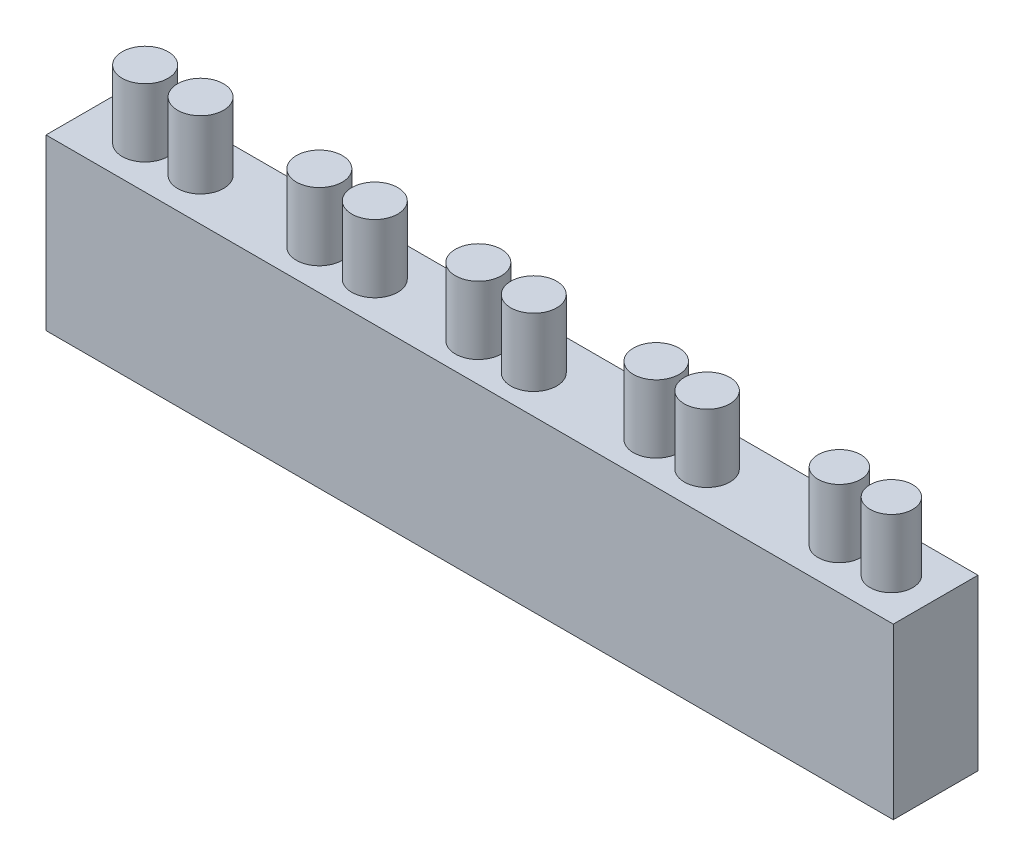
ISO-10303-21;
HEADER;
FILE_DESCRIPTION(('STEP AP214'),'2;1');
FILE_NAME('part.step','',(''),(''),'','','');
FILE_SCHEMA(('AUTOMOTIVE_DESIGN { 1 0 10303 214 1 1 1 1 }'));
ENDSEC;
DATA;
#1=APPLICATION_CONTEXT('core data for automotive mechanical design processes');
#2=APPLICATION_PROTOCOL_DEFINITION('international standard','automotive_design',2000,#1);
#3=PRODUCT_CONTEXT('',#1,'mechanical');
#4=PRODUCT('Part','Part','',(#3));
#5=PRODUCT_RELATED_PRODUCT_CATEGORY('part','',(#4));
#6=PRODUCT_DEFINITION_FORMATION('','',#4);
#7=PRODUCT_DEFINITION_CONTEXT('part definition',#1,'design');
#8=PRODUCT_DEFINITION('design','',#6,#7);
#9=PRODUCT_DEFINITION_SHAPE('','',#8);
#10=(LENGTH_UNIT() NAMED_UNIT(*) SI_UNIT(.MILLI.,.METRE.));
#11=(NAMED_UNIT(*) PLANE_ANGLE_UNIT() SI_UNIT($,.RADIAN.));
#12=(NAMED_UNIT(*) SI_UNIT($,.STERADIAN.) SOLID_ANGLE_UNIT());
#13=UNCERTAINTY_MEASURE_WITH_UNIT(LENGTH_MEASURE(1.E-05),#10,'distance_accuracy_value','');
#14=(GEOMETRIC_REPRESENTATION_CONTEXT(3) GLOBAL_UNCERTAINTY_ASSIGNED_CONTEXT((#13)) GLOBAL_UNIT_ASSIGNED_CONTEXT((#10,
#11,#12)) REPRESENTATION_CONTEXT('',''));
#15=CARTESIAN_POINT('',(0.,0.,0.));
#16=DIRECTION('',(0.,0.,1.));
#17=DIRECTION('',(1.,0.,0.));
#18=AXIS2_PLACEMENT_3D('',#15,#16,#17);
#19=CARTESIAN_POINT('',(0.,20.,0.));
#20=DIRECTION('',(0.,1.,0.));
#21=DIRECTION('',(0.,0.,1.));
#22=AXIS2_PLACEMENT_3D('',#19,#20,#21);
#23=PLANE('',#22);
#24=CARTESIAN_POINT('',(-3.44704388297118,20.,0.524988505592336));
#25=DIRECTION('',(0.,1.,0.));
#26=DIRECTION('',(0.,0.,1.));
#27=AXIS2_PLACEMENT_3D('',#24,#25,#26);
#28=CIRCLE('',#27,2.71315340695769);
#29=CARTESIAN_POINT('',(-3.44704388297118,20.,3.23814191255003));
#30=VERTEX_POINT('',#29);
#31=EDGE_CURVE('E159',#30,#30,#28,.T.);
#32=ORIENTED_EDGE('',*,*,#31,.F.);
#33=EDGE_LOOP('',(#32));
#34=FACE_BOUND('',#33,.T.);
#35=CARTESIAN_POINT('',(38.7616003818353,20.,0.11900147053821));
#36=DIRECTION('',(0.,1.,0.));
#37=DIRECTION('',(0.,0.,1.));
#38=AXIS2_PLACEMENT_3D('',#35,#36,#37);
#39=CIRCLE('',#38,2.52376901384696);
#40=CARTESIAN_POINT('',(38.7616003818353,20.,2.64277048438517));
#41=VERTEX_POINT('',#40);
#42=EDGE_CURVE('E147',#41,#41,#39,.T.);
#43=ORIENTED_EDGE('',*,*,#42,.F.);
#44=EDGE_LOOP('',(#43));
#45=FACE_BOUND('',#44,.T.);
#46=CARTESIAN_POINT('',(17.1400462940193,20.,0.11900147053821));
#47=DIRECTION('',(0.,1.,0.));
#48=DIRECTION('',(0.,0.,1.));
#49=AXIS2_PLACEMENT_3D('',#46,#47,#48);
#50=CIRCLE('',#49,2.6941898888317);
#51=CARTESIAN_POINT('',(17.1400462940193,20.,2.81319135936991));
#52=VERTEX_POINT('',#51);
#53=EDGE_CURVE('E135',#52,#52,#50,.T.);
#54=ORIENTED_EDGE('',*,*,#53,.F.);
#55=EDGE_LOOP('',(#54));
#56=FACE_BOUND('',#55,.T.);
#57=CARTESIAN_POINT('',(-22.408108815246,20.,0.328361024446603));
#58=DIRECTION('',(0.,1.,0.));
#59=DIRECTION('',(0.,0.,1.));
#60=AXIS2_PLACEMENT_3D('',#57,#58,#59);
#61=CIRCLE('',#60,2.71315340695769);
#62=CARTESIAN_POINT('',(-22.408108815246,20.,3.04151443140429));
#63=VERTEX_POINT('',#62);
#64=EDGE_CURVE('E123',#63,#63,#61,.T.);
#65=ORIENTED_EDGE('',*,*,#64,.F.);
#66=EDGE_LOOP('',(#65));
#67=FACE_BOUND('',#66,.T.);
#68=CARTESIAN_POINT('',(-43.2986101598277,20.,0.));
#69=DIRECTION('',(0.,1.,0.));
#70=DIRECTION('',(0.,0.,1.));
#71=AXIS2_PLACEMENT_3D('',#68,#69,#70);
#72=CIRCLE('',#71,2.71315340695769);
#73=CARTESIAN_POINT('',(-43.2986101598277,20.,2.71315340695769));
#74=VERTEX_POINT('',#73);
#75=EDGE_CURVE('E111',#74,#74,#72,.T.);
#76=ORIENTED_EDGE('',*,*,#75,.F.);
#77=EDGE_LOOP('',(#76));
#78=FACE_BOUND('',#77,.T.);
#79=DIRECTION('',(0.,0.,1.));
#80=VECTOR('',#79,1.);
#81=CARTESIAN_POINT('',(-50.,20.,5.00000000000001));
#82=LINE('',#81,#80);
#83=CARTESIAN_POINT('',(-50.,20.,-4.99999999999999));
#84=VERTEX_POINT('',#83);
#85=CARTESIAN_POINT('',(-50.,20.,5.00000000000001));
#86=VERTEX_POINT('',#85);
#87=EDGE_CURVE('E85',#84,#86,#82,.T.);
#88=ORIENTED_EDGE('',*,*,#87,.T.);
#89=DIRECTION('',(1.,0.,0.));
#90=VECTOR('',#89,1.);
#91=CARTESIAN_POINT('',(50.,20.,5.));
#92=LINE('',#91,#90);
#93=CARTESIAN_POINT('',(50.,20.,5.));
#94=VERTEX_POINT('',#93);
#95=EDGE_CURVE('E80',#86,#94,#92,.T.);
#96=ORIENTED_EDGE('',*,*,#95,.T.);
#97=DIRECTION('',(0.,0.,-1.));
#98=VECTOR('',#97,1.);
#99=CARTESIAN_POINT('',(50.,20.,5.));
#100=LINE('',#99,#98);
#101=CARTESIAN_POINT('',(50.,20.,-5.));
#102=VERTEX_POINT('',#101);
#103=EDGE_CURVE('E83',#94,#102,#100,.T.);
#104=ORIENTED_EDGE('',*,*,#103,.T.);
#105=DIRECTION('',(-1.,0.,0.));
#106=VECTOR('',#105,1.);
#107=CARTESIAN_POINT('',(50.,20.,-5.));
#108=LINE('',#107,#106);
#109=EDGE_CURVE('E50',#102,#84,#108,.T.);
#110=ORIENTED_EDGE('',*,*,#109,.T.);
#111=EDGE_LOOP('',(#88,#96,#104,#110));
#112=FACE_BOUND('',#111,.T.);
#113=CARTESIAN_POINT('',(-36.7580746432053,20.,0.));
#114=DIRECTION('',(0.,1.,0.));
#115=DIRECTION('',(0.,0.,1.));
#116=AXIS2_PLACEMENT_3D('',#113,#114,#115);
#117=CIRCLE('',#116,2.7131534069577);
#118=CARTESIAN_POINT('',(-36.7580746432053,20.,2.7131534069577));
#119=VERTEX_POINT('',#118);
#120=EDGE_CURVE('E117',#119,#119,#117,.T.);
#121=ORIENTED_EDGE('',*,*,#120,.F.);
#122=EDGE_LOOP('',(#121));
#123=FACE_BOUND('',#122,.T.);
#124=CARTESIAN_POINT('',(-15.8675732986236,20.,0.328361024446603));
#125=DIRECTION('',(0.,1.,0.));
#126=DIRECTION('',(0.,0.,1.));
#127=AXIS2_PLACEMENT_3D('',#124,#125,#126);
#128=CIRCLE('',#127,2.7131534069577);
#129=CARTESIAN_POINT('',(-15.8675732986236,20.,3.0415144314043));
#130=VERTEX_POINT('',#129);
#131=EDGE_CURVE('E129',#130,#130,#128,.T.);
#132=ORIENTED_EDGE('',*,*,#131,.F.);
#133=EDGE_LOOP('',(#132));
#134=FACE_BOUND('',#133,.T.);
#135=CARTESIAN_POINT('',(23.1469486987069,20.,0.11900147053821));
#136=DIRECTION('',(0.,1.,0.));
#137=DIRECTION('',(0.,0.,1.));
#138=AXIS2_PLACEMENT_3D('',#135,#136,#137);
#139=CIRCLE('',#138,2.69418988883171);
#140=CARTESIAN_POINT('',(23.1469486987069,20.,2.81319135936992));
#141=VERTEX_POINT('',#140);
#142=EDGE_CURVE('E141',#141,#141,#139,.T.);
#143=ORIENTED_EDGE('',*,*,#142,.F.);
#144=EDGE_LOOP('',(#143));
#145=FACE_BOUND('',#144,.T.);
#146=CARTESIAN_POINT('',(44.8983811690858,20.,0.11900147053821));
#147=DIRECTION('',(0.,1.,0.));
#148=DIRECTION('',(0.,0.,1.));
#149=AXIS2_PLACEMENT_3D('',#146,#147,#148);
#150=CIRCLE('',#149,2.52376901384696);
#151=CARTESIAN_POINT('',(44.8983811690858,20.,2.64277048438517));
#152=VERTEX_POINT('',#151);
#153=EDGE_CURVE('E153',#152,#152,#150,.T.);
#154=ORIENTED_EDGE('',*,*,#153,.F.);
#155=EDGE_LOOP('',(#154));
#156=FACE_BOUND('',#155,.T.);
#157=CARTESIAN_POINT('',(3.09349163365126,20.,0.524988505592336));
#158=DIRECTION('',(0.,1.,0.));
#159=DIRECTION('',(0.,0.,1.));
#160=AXIS2_PLACEMENT_3D('',#157,#158,#159);
#161=CIRCLE('',#160,2.7131534069577);
#162=CARTESIAN_POINT('',(3.09349163365126,20.,3.23814191255003));
#163=VERTEX_POINT('',#162);
#164=EDGE_CURVE('E165',#163,#163,#161,.T.);
#165=ORIENTED_EDGE('',*,*,#164,.F.);
#166=EDGE_LOOP('',(#165));
#167=FACE_BOUND('',#166,.T.);
#168=ADVANCED_FACE('F33',(#34,#45,#56,#67,#78,#112,#123,#134,#145,#156,#167),#23,.T.);
#169=CARTESIAN_POINT('',(-50.,20.,5.00000000000001));
#170=DIRECTION('',(1.,0.,0.));
#171=DIRECTION('',(0.,0.,-1.));
#172=AXIS2_PLACEMENT_3D('',#169,#170,#171);
#173=PLANE('',#172);
#174=DIRECTION('',(0.,0.,1.));
#175=VECTOR('',#174,1.);
#176=CARTESIAN_POINT('',(-50.,0.,5.00000000000001));
#177=LINE('',#176,#175);
#178=CARTESIAN_POINT('',(-50.,0.,-4.99999999999999));
#179=VERTEX_POINT('',#178);
#180=CARTESIAN_POINT('',(-50.,0.,5.00000000000001));
#181=VERTEX_POINT('',#180);
#182=EDGE_CURVE('E97',#179,#181,#177,.T.);
#183=ORIENTED_EDGE('',*,*,#182,.T.);
#184=DIRECTION('',(0.,-1.,0.));
#185=VECTOR('',#184,1.);
#186=CARTESIAN_POINT('',(-50.,20.,5.00000000000001));
#187=LINE('',#186,#185);
#188=EDGE_CURVE('E11',#86,#181,#187,.T.);
#189=ORIENTED_EDGE('',*,*,#188,.F.);
#190=ORIENTED_EDGE('',*,*,#87,.F.);
#191=DIRECTION('',(0.,-1.,0.));
#192=VECTOR('',#191,1.);
#193=CARTESIAN_POINT('',(-50.,20.,-4.99999999999999));
#194=LINE('',#193,#192);
#195=EDGE_CURVE('E93',#84,#179,#194,.T.);
#196=ORIENTED_EDGE('',*,*,#195,.T.);
#197=EDGE_LOOP('',(#183,#189,#190,#196));
#198=FACE_BOUND('',#197,.T.);
#199=ADVANCED_FACE('F35',(#198),#173,.F.);
#200=CARTESIAN_POINT('',(50.,20.,5.));
#201=DIRECTION('',(0.,0.,-1.));
#202=DIRECTION('',(-1.,0.,0.));
#203=AXIS2_PLACEMENT_3D('',#200,#201,#202);
#204=PLANE('',#203);
#205=DIRECTION('',(1.,0.,0.));
#206=VECTOR('',#205,1.);
#207=CARTESIAN_POINT('',(50.,0.,5.));
#208=LINE('',#207,#206);
#209=CARTESIAN_POINT('',(50.,0.,5.));
#210=VERTEX_POINT('',#209);
#211=EDGE_CURVE('E89',#181,#210,#208,.T.);
#212=ORIENTED_EDGE('',*,*,#211,.T.);
#213=DIRECTION('',(0.,-1.,0.));
#214=VECTOR('',#213,1.);
#215=CARTESIAN_POINT('',(50.,20.,5.));
#216=LINE('',#215,#214);
#217=EDGE_CURVE('E42',#94,#210,#216,.T.);
#218=ORIENTED_EDGE('',*,*,#217,.F.);
#219=ORIENTED_EDGE('',*,*,#95,.F.);
#220=ORIENTED_EDGE('',*,*,#188,.T.);
#221=EDGE_LOOP('',(#212,#218,#219,#220));
#222=FACE_BOUND('',#221,.T.);
#223=ADVANCED_FACE('F88',(#222),#204,.F.);
#224=CARTESIAN_POINT('',(50.,20.,5.));
#225=DIRECTION('',(-1.,0.,0.));
#226=DIRECTION('',(0.,0.,1.));
#227=AXIS2_PLACEMENT_3D('',#224,#225,#226);
#228=PLANE('',#227);
#229=DIRECTION('',(0.,0.,-1.));
#230=VECTOR('',#229,1.);
#231=CARTESIAN_POINT('',(50.,0.,5.));
#232=LINE('',#231,#230);
#233=CARTESIAN_POINT('',(50.,0.,-5.));
#234=VERTEX_POINT('',#233);
#235=EDGE_CURVE('E67',#210,#234,#232,.T.);
#236=ORIENTED_EDGE('',*,*,#235,.T.);
#237=DIRECTION('',(0.,-1.,0.));
#238=VECTOR('',#237,1.);
#239=CARTESIAN_POINT('',(50.,20.,-5.));
#240=LINE('',#239,#238);
#241=EDGE_CURVE('E90',#102,#234,#240,.T.);
#242=ORIENTED_EDGE('',*,*,#241,.F.);
#243=ORIENTED_EDGE('',*,*,#103,.F.);
#244=ORIENTED_EDGE('',*,*,#217,.T.);
#245=EDGE_LOOP('',(#236,#242,#243,#244));
#246=FACE_BOUND('',#245,.T.);
#247=ADVANCED_FACE('F91',(#246),#228,.F.);
#248=CARTESIAN_POINT('',(50.,20.,-5.));
#249=DIRECTION('',(0.,0.,1.));
#250=DIRECTION('',(1.,0.,0.));
#251=AXIS2_PLACEMENT_3D('',#248,#249,#250);
#252=PLANE('',#251);
#253=DIRECTION('',(-1.,0.,0.));
#254=VECTOR('',#253,1.);
#255=CARTESIAN_POINT('',(50.,0.,-5.));
#256=LINE('',#255,#254);
#257=EDGE_CURVE('E73',#234,#179,#256,.T.);
#258=ORIENTED_EDGE('',*,*,#257,.T.);
#259=ORIENTED_EDGE('',*,*,#195,.F.);
#260=ORIENTED_EDGE('',*,*,#109,.F.);
#261=ORIENTED_EDGE('',*,*,#241,.T.);
#262=EDGE_LOOP('',(#258,#259,#260,#261));
#263=FACE_BOUND('',#262,.T.);
#264=ADVANCED_FACE('F105',(#263),#252,.F.);
#265=CARTESIAN_POINT('',(0.,0.,0.));
#266=DIRECTION('',(0.,1.,0.));
#267=DIRECTION('',(0.,0.,1.));
#268=AXIS2_PLACEMENT_3D('',#265,#266,#267);
#269=PLANE('',#268);
#270=ORIENTED_EDGE('',*,*,#182,.F.);
#271=ORIENTED_EDGE('',*,*,#257,.F.);
#272=ORIENTED_EDGE('',*,*,#235,.F.);
#273=ORIENTED_EDGE('',*,*,#211,.F.);
#274=EDGE_LOOP('',(#270,#271,#272,#273));
#275=FACE_BOUND('',#274,.T.);
#276=ADVANCED_FACE('F108',(#275),#269,.F.);
#277=CARTESIAN_POINT('',(-43.2986101598277,28.,0.));
#278=DIRECTION('',(0.,-1.,0.));
#279=DIRECTION('',(0.,0.,-1.));
#280=AXIS2_PLACEMENT_3D('',#277,#278,#279);
#281=CYLINDRICAL_SURFACE('',#280,2.71315340695769);
#282=CARTESIAN_POINT('',(-43.2986101598277,28.,0.));
#283=DIRECTION('',(0.,1.,0.));
#284=DIRECTION('',(0.,0.,1.));
#285=AXIS2_PLACEMENT_3D('',#282,#283,#284);
#286=CIRCLE('',#285,2.71315340695769);
#287=CARTESIAN_POINT('',(-43.2986101598277,28.,2.71315340695769));
#288=VERTEX_POINT('',#287);
#289=EDGE_CURVE('E100',#288,#288,#286,.T.);
#290=ORIENTED_EDGE('',*,*,#289,.F.);
#291=EDGE_LOOP('',(#290));
#292=FACE_BOUND('',#291,.T.);
#293=ORIENTED_EDGE('',*,*,#75,.T.);
#294=EDGE_LOOP('',(#293));
#295=FACE_BOUND('',#294,.T.);
#296=ADVANCED_FACE('F190',(#292,#295),#281,.T.);
#297=CARTESIAN_POINT('',(-43.2986101598277,28.,0.));
#298=DIRECTION('',(0.,1.,0.));
#299=DIRECTION('',(0.,0.,1.));
#300=AXIS2_PLACEMENT_3D('',#297,#298,#299);
#301=PLANE('',#300);
#302=ORIENTED_EDGE('',*,*,#289,.T.);
#303=EDGE_LOOP('',(#302));
#304=FACE_BOUND('',#303,.T.);
#305=ADVANCED_FACE('F220',(#304),#301,.T.);
#306=CARTESIAN_POINT('',(-36.7580746432053,28.,0.));
#307=DIRECTION('',(0.,-1.,0.));
#308=DIRECTION('',(0.,0.,-1.));
#309=AXIS2_PLACEMENT_3D('',#306,#307,#308);
#310=CYLINDRICAL_SURFACE('',#309,2.7131534069577);
#311=CARTESIAN_POINT('',(-36.7580746432053,28.,0.));
#312=DIRECTION('',(0.,1.,0.));
#313=DIRECTION('',(0.,0.,1.));
#314=AXIS2_PLACEMENT_3D('',#311,#312,#313);
#315=CIRCLE('',#314,2.7131534069577);
#316=CARTESIAN_POINT('',(-36.7580746432053,28.,2.7131534069577));
#317=VERTEX_POINT('',#316);
#318=EDGE_CURVE('E114',#317,#317,#315,.T.);
#319=ORIENTED_EDGE('',*,*,#318,.F.);
#320=EDGE_LOOP('',(#319));
#321=FACE_BOUND('',#320,.T.);
#322=ORIENTED_EDGE('',*,*,#120,.T.);
#323=EDGE_LOOP('',(#322));
#324=FACE_BOUND('',#323,.T.);
#325=ADVANCED_FACE('F227',(#321,#324),#310,.T.);
#326=CARTESIAN_POINT('',(-36.7580746432053,28.,0.));
#327=DIRECTION('',(0.,1.,0.));
#328=DIRECTION('',(0.,0.,1.));
#329=AXIS2_PLACEMENT_3D('',#326,#327,#328);
#330=PLANE('',#329);
#331=ORIENTED_EDGE('',*,*,#318,.T.);
#332=EDGE_LOOP('',(#331));
#333=FACE_BOUND('',#332,.T.);
#334=ADVANCED_FACE('F234',(#333),#330,.T.);
#335=CARTESIAN_POINT('',(-22.408108815246,28.,0.328361024446603));
#336=DIRECTION('',(0.,-1.,0.));
#337=DIRECTION('',(0.,0.,-1.));
#338=AXIS2_PLACEMENT_3D('',#335,#336,#337);
#339=CYLINDRICAL_SURFACE('',#338,2.71315340695769);
#340=CARTESIAN_POINT('',(-22.408108815246,28.,0.328361024446603));
#341=DIRECTION('',(0.,1.,0.));
#342=DIRECTION('',(0.,0.,1.));
#343=AXIS2_PLACEMENT_3D('',#340,#341,#342);
#344=CIRCLE('',#343,2.71315340695769);
#345=CARTESIAN_POINT('',(-22.408108815246,28.,3.04151443140429));
#346=VERTEX_POINT('',#345);
#347=EDGE_CURVE('E120',#346,#346,#344,.T.);
#348=ORIENTED_EDGE('',*,*,#347,.F.);
#349=EDGE_LOOP('',(#348));
#350=FACE_BOUND('',#349,.T.);
#351=ORIENTED_EDGE('',*,*,#64,.T.);
#352=EDGE_LOOP('',(#351));
#353=FACE_BOUND('',#352,.T.);
#354=ADVANCED_FACE('F242',(#350,#353),#339,.T.);
#355=CARTESIAN_POINT('',(-22.408108815246,28.,0.328361024446603));
#356=DIRECTION('',(0.,1.,0.));
#357=DIRECTION('',(0.,0.,1.));
#358=AXIS2_PLACEMENT_3D('',#355,#356,#357);
#359=PLANE('',#358);
#360=ORIENTED_EDGE('',*,*,#347,.T.);
#361=EDGE_LOOP('',(#360));
#362=FACE_BOUND('',#361,.T.);
#363=ADVANCED_FACE('F250',(#362),#359,.T.);
#364=CARTESIAN_POINT('',(-15.8675732986236,28.,0.328361024446603));
#365=DIRECTION('',(0.,-1.,0.));
#366=DIRECTION('',(0.,0.,-1.));
#367=AXIS2_PLACEMENT_3D('',#364,#365,#366);
#368=CYLINDRICAL_SURFACE('',#367,2.7131534069577);
#369=CARTESIAN_POINT('',(-15.8675732986236,28.,0.328361024446603));
#370=DIRECTION('',(0.,1.,0.));
#371=DIRECTION('',(0.,0.,1.));
#372=AXIS2_PLACEMENT_3D('',#369,#370,#371);
#373=CIRCLE('',#372,2.7131534069577);
#374=CARTESIAN_POINT('',(-15.8675732986236,28.,3.0415144314043));
#375=VERTEX_POINT('',#374);
#376=EDGE_CURVE('E126',#375,#375,#373,.T.);
#377=ORIENTED_EDGE('',*,*,#376,.F.);
#378=EDGE_LOOP('',(#377));
#379=FACE_BOUND('',#378,.T.);
#380=ORIENTED_EDGE('',*,*,#131,.T.);
#381=EDGE_LOOP('',(#380));
#382=FACE_BOUND('',#381,.T.);
#383=ADVANCED_FACE('F258',(#379,#382),#368,.T.);
#384=CARTESIAN_POINT('',(-15.8675732986236,28.,0.328361024446603));
#385=DIRECTION('',(0.,1.,0.));
#386=DIRECTION('',(0.,0.,1.));
#387=AXIS2_PLACEMENT_3D('',#384,#385,#386);
#388=PLANE('',#387);
#389=ORIENTED_EDGE('',*,*,#376,.T.);
#390=EDGE_LOOP('',(#389));
#391=FACE_BOUND('',#390,.T.);
#392=ADVANCED_FACE('F266',(#391),#388,.T.);
#393=CARTESIAN_POINT('',(17.1400462940193,28.,0.11900147053821));
#394=DIRECTION('',(0.,-1.,0.));
#395=DIRECTION('',(0.,0.,-1.));
#396=AXIS2_PLACEMENT_3D('',#393,#394,#395);
#397=CYLINDRICAL_SURFACE('',#396,2.6941898888317);
#398=CARTESIAN_POINT('',(17.1400462940193,28.,0.11900147053821));
#399=DIRECTION('',(0.,1.,0.));
#400=DIRECTION('',(0.,0.,1.));
#401=AXIS2_PLACEMENT_3D('',#398,#399,#400);
#402=CIRCLE('',#401,2.6941898888317);
#403=CARTESIAN_POINT('',(17.1400462940193,28.,2.81319135936991));
#404=VERTEX_POINT('',#403);
#405=EDGE_CURVE('E132',#404,#404,#402,.T.);
#406=ORIENTED_EDGE('',*,*,#405,.F.);
#407=EDGE_LOOP('',(#406));
#408=FACE_BOUND('',#407,.T.);
#409=ORIENTED_EDGE('',*,*,#53,.T.);
#410=EDGE_LOOP('',(#409));
#411=FACE_BOUND('',#410,.T.);
#412=ADVANCED_FACE('F274',(#408,#411),#397,.T.);
#413=CARTESIAN_POINT('',(17.1400462940193,28.,0.11900147053821));
#414=DIRECTION('',(0.,1.,0.));
#415=DIRECTION('',(0.,0.,1.));
#416=AXIS2_PLACEMENT_3D('',#413,#414,#415);
#417=PLANE('',#416);
#418=ORIENTED_EDGE('',*,*,#405,.T.);
#419=EDGE_LOOP('',(#418));
#420=FACE_BOUND('',#419,.T.);
#421=ADVANCED_FACE('F282',(#420),#417,.T.);
#422=CARTESIAN_POINT('',(23.1469486987069,28.,0.11900147053821));
#423=DIRECTION('',(0.,-1.,0.));
#424=DIRECTION('',(0.,0.,-1.));
#425=AXIS2_PLACEMENT_3D('',#422,#423,#424);
#426=CYLINDRICAL_SURFACE('',#425,2.69418988883171);
#427=CARTESIAN_POINT('',(23.1469486987069,28.,0.11900147053821));
#428=DIRECTION('',(0.,1.,0.));
#429=DIRECTION('',(0.,0.,1.));
#430=AXIS2_PLACEMENT_3D('',#427,#428,#429);
#431=CIRCLE('',#430,2.69418988883171);
#432=CARTESIAN_POINT('',(23.1469486987069,28.,2.81319135936992));
#433=VERTEX_POINT('',#432);
#434=EDGE_CURVE('E138',#433,#433,#431,.T.);
#435=ORIENTED_EDGE('',*,*,#434,.F.);
#436=EDGE_LOOP('',(#435));
#437=FACE_BOUND('',#436,.T.);
#438=ORIENTED_EDGE('',*,*,#142,.T.);
#439=EDGE_LOOP('',(#438));
#440=FACE_BOUND('',#439,.T.);
#441=ADVANCED_FACE('F290',(#437,#440),#426,.T.);
#442=CARTESIAN_POINT('',(23.1469486987069,28.,0.11900147053821));
#443=DIRECTION('',(0.,1.,0.));
#444=DIRECTION('',(0.,0.,1.));
#445=AXIS2_PLACEMENT_3D('',#442,#443,#444);
#446=PLANE('',#445);
#447=ORIENTED_EDGE('',*,*,#434,.T.);
#448=EDGE_LOOP('',(#447));
#449=FACE_BOUND('',#448,.T.);
#450=ADVANCED_FACE('F298',(#449),#446,.T.);
#451=CARTESIAN_POINT('',(38.7616003818353,28.,0.11900147053821));
#452=DIRECTION('',(0.,-1.,0.));
#453=DIRECTION('',(0.,0.,-1.));
#454=AXIS2_PLACEMENT_3D('',#451,#452,#453);
#455=CYLINDRICAL_SURFACE('',#454,2.52376901384696);
#456=CARTESIAN_POINT('',(38.7616003818353,28.,0.11900147053821));
#457=DIRECTION('',(0.,1.,0.));
#458=DIRECTION('',(0.,0.,1.));
#459=AXIS2_PLACEMENT_3D('',#456,#457,#458);
#460=CIRCLE('',#459,2.52376901384696);
#461=CARTESIAN_POINT('',(38.7616003818353,28.,2.64277048438517));
#462=VERTEX_POINT('',#461);
#463=EDGE_CURVE('E144',#462,#462,#460,.T.);
#464=ORIENTED_EDGE('',*,*,#463,.F.);
#465=EDGE_LOOP('',(#464));
#466=FACE_BOUND('',#465,.T.);
#467=ORIENTED_EDGE('',*,*,#42,.T.);
#468=EDGE_LOOP('',(#467));
#469=FACE_BOUND('',#468,.T.);
#470=ADVANCED_FACE('F306',(#466,#469),#455,.T.);
#471=CARTESIAN_POINT('',(38.7616003818353,28.,0.11900147053821));
#472=DIRECTION('',(0.,1.,0.));
#473=DIRECTION('',(0.,0.,1.));
#474=AXIS2_PLACEMENT_3D('',#471,#472,#473);
#475=PLANE('',#474);
#476=ORIENTED_EDGE('',*,*,#463,.T.);
#477=EDGE_LOOP('',(#476));
#478=FACE_BOUND('',#477,.T.);
#479=ADVANCED_FACE('F314',(#478),#475,.T.);
#480=CARTESIAN_POINT('',(44.8983811690858,28.,0.11900147053821));
#481=DIRECTION('',(0.,-1.,0.));
#482=DIRECTION('',(0.,0.,-1.));
#483=AXIS2_PLACEMENT_3D('',#480,#481,#482);
#484=CYLINDRICAL_SURFACE('',#483,2.52376901384696);
#485=CARTESIAN_POINT('',(44.8983811690858,28.,0.11900147053821));
#486=DIRECTION('',(0.,1.,0.));
#487=DIRECTION('',(0.,0.,1.));
#488=AXIS2_PLACEMENT_3D('',#485,#486,#487);
#489=CIRCLE('',#488,2.52376901384696);
#490=CARTESIAN_POINT('',(44.8983811690858,28.,2.64277048438517));
#491=VERTEX_POINT('',#490);
#492=EDGE_CURVE('E150',#491,#491,#489,.T.);
#493=ORIENTED_EDGE('',*,*,#492,.F.);
#494=EDGE_LOOP('',(#493));
#495=FACE_BOUND('',#494,.T.);
#496=ORIENTED_EDGE('',*,*,#153,.T.);
#497=EDGE_LOOP('',(#496));
#498=FACE_BOUND('',#497,.T.);
#499=ADVANCED_FACE('F322',(#495,#498),#484,.T.);
#500=CARTESIAN_POINT('',(44.8983811690858,28.,0.11900147053821));
#501=DIRECTION('',(0.,1.,0.));
#502=DIRECTION('',(0.,0.,1.));
#503=AXIS2_PLACEMENT_3D('',#500,#501,#502);
#504=PLANE('',#503);
#505=ORIENTED_EDGE('',*,*,#492,.T.);
#506=EDGE_LOOP('',(#505));
#507=FACE_BOUND('',#506,.T.);
#508=ADVANCED_FACE('F330',(#507),#504,.T.);
#509=CARTESIAN_POINT('',(-3.44704388297118,28.,0.524988505592336));
#510=DIRECTION('',(0.,-1.,0.));
#511=DIRECTION('',(0.,0.,-1.));
#512=AXIS2_PLACEMENT_3D('',#509,#510,#511);
#513=CYLINDRICAL_SURFACE('',#512,2.71315340695769);
#514=CARTESIAN_POINT('',(-3.44704388297118,28.,0.524988505592336));
#515=DIRECTION('',(0.,1.,0.));
#516=DIRECTION('',(0.,0.,1.));
#517=AXIS2_PLACEMENT_3D('',#514,#515,#516);
#518=CIRCLE('',#517,2.71315340695769);
#519=CARTESIAN_POINT('',(-3.44704388297118,28.,3.23814191255003));
#520=VERTEX_POINT('',#519);
#521=EDGE_CURVE('E156',#520,#520,#518,.T.);
#522=ORIENTED_EDGE('',*,*,#521,.F.);
#523=EDGE_LOOP('',(#522));
#524=FACE_BOUND('',#523,.T.);
#525=ORIENTED_EDGE('',*,*,#31,.T.);
#526=EDGE_LOOP('',(#525));
#527=FACE_BOUND('',#526,.T.);
#528=ADVANCED_FACE('F338',(#524,#527),#513,.T.);
#529=CARTESIAN_POINT('',(-3.44704388297118,28.,0.524988505592336));
#530=DIRECTION('',(0.,1.,0.));
#531=DIRECTION('',(0.,0.,1.));
#532=AXIS2_PLACEMENT_3D('',#529,#530,#531);
#533=PLANE('',#532);
#534=ORIENTED_EDGE('',*,*,#521,.T.);
#535=EDGE_LOOP('',(#534));
#536=FACE_BOUND('',#535,.T.);
#537=ADVANCED_FACE('F176',(#536),#533,.T.);
#538=CARTESIAN_POINT('',(3.09349163365126,28.,0.524988505592336));
#539=DIRECTION('',(0.,-1.,0.));
#540=DIRECTION('',(0.,0.,-1.));
#541=AXIS2_PLACEMENT_3D('',#538,#539,#540);
#542=CYLINDRICAL_SURFACE('',#541,2.7131534069577);
#543=CARTESIAN_POINT('',(3.09349163365126,28.,0.524988505592336));
#544=DIRECTION('',(0.,1.,0.));
#545=DIRECTION('',(0.,0.,1.));
#546=AXIS2_PLACEMENT_3D('',#543,#544,#545);
#547=CIRCLE('',#546,2.7131534069577);
#548=CARTESIAN_POINT('',(3.09349163365126,28.,3.23814191255003));
#549=VERTEX_POINT('',#548);
#550=EDGE_CURVE('E162',#549,#549,#547,.T.);
#551=ORIENTED_EDGE('',*,*,#550,.F.);
#552=EDGE_LOOP('',(#551));
#553=FACE_BOUND('',#552,.T.);
#554=ORIENTED_EDGE('',*,*,#164,.T.);
#555=EDGE_LOOP('',(#554));
#556=FACE_BOUND('',#555,.T.);
#557=ADVANCED_FACE('F173',(#553,#556),#542,.T.);
#558=CARTESIAN_POINT('',(3.09349163365126,28.,0.524988505592336));
#559=DIRECTION('',(0.,1.,0.));
#560=DIRECTION('',(0.,0.,1.));
#561=AXIS2_PLACEMENT_3D('',#558,#559,#560);
#562=PLANE('',#561);
#563=ORIENTED_EDGE('',*,*,#550,.T.);
#564=EDGE_LOOP('',(#563));
#565=FACE_BOUND('',#564,.T.);
#566=ADVANCED_FACE('F171',(#565),#562,.T.);
#567=CLOSED_SHELL('',(#168,#199,#223,#247,#264,#276,#296,#305,#325,#334,#354,#363,#383,#392,
#412,#421,#441,#450,#470,#479,#499,#508,#528,#537,#557,#566));
#568=MANIFOLD_SOLID_BREP('B2',#567);
#569=ADVANCED_BREP_SHAPE_REPRESENTATION('',(#18,#568),#14);
#570=SHAPE_DEFINITION_REPRESENTATION(#9,#569);
ENDSEC;
END-ISO-10303-21;
